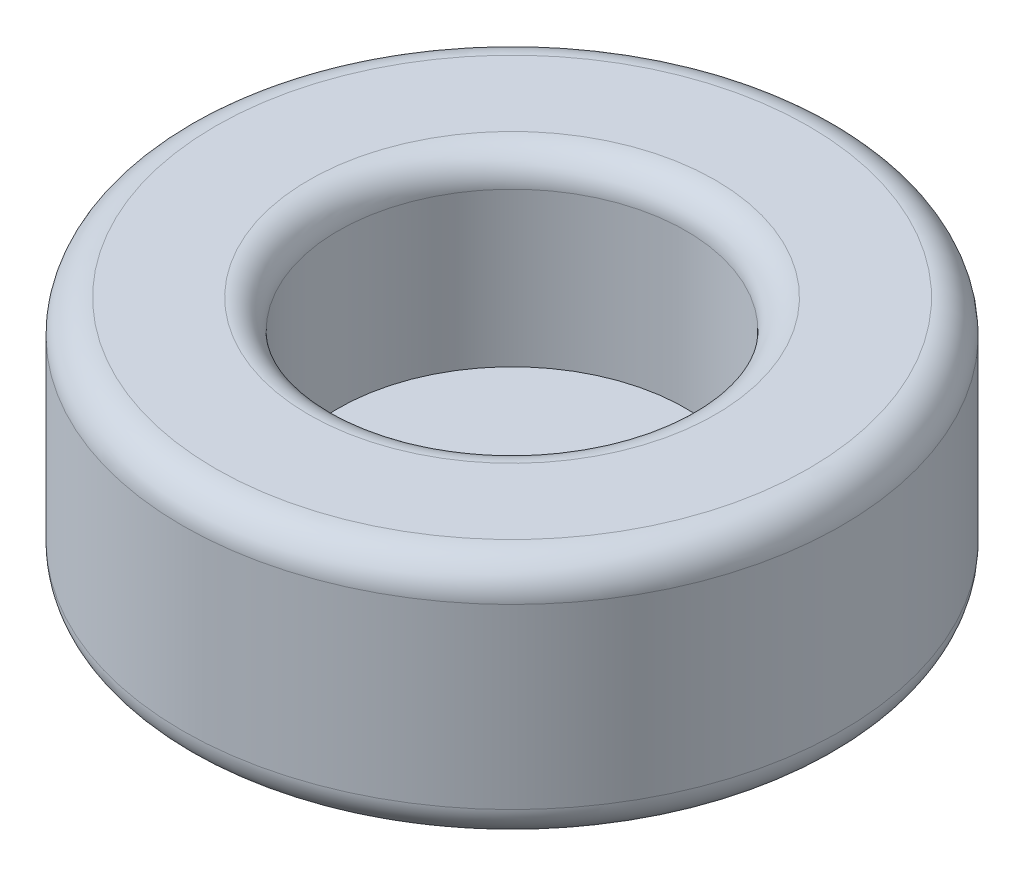
ISO-10303-21;
HEADER;
FILE_DESCRIPTION(('STEP AP214'),'2;1');
FILE_NAME('part.step','',(''),(''),'','','');
FILE_SCHEMA(('AUTOMOTIVE_DESIGN { 1 0 10303 214 1 1 1 1 }'));
ENDSEC;
DATA;
#1=APPLICATION_CONTEXT('core data for automotive mechanical design processes');
#2=APPLICATION_PROTOCOL_DEFINITION('international standard','automotive_design',2000,#1);
#3=PRODUCT_CONTEXT('',#1,'mechanical');
#4=PRODUCT('Part','Part','',(#3));
#5=PRODUCT_RELATED_PRODUCT_CATEGORY('part','',(#4));
#6=PRODUCT_DEFINITION_FORMATION('','',#4);
#7=PRODUCT_DEFINITION_CONTEXT('part definition',#1,'design');
#8=PRODUCT_DEFINITION('design','',#6,#7);
#9=PRODUCT_DEFINITION_SHAPE('','',#8);
#10=(LENGTH_UNIT() NAMED_UNIT(*) SI_UNIT(.MILLI.,.METRE.));
#11=(NAMED_UNIT(*) PLANE_ANGLE_UNIT() SI_UNIT($,.RADIAN.));
#12=(NAMED_UNIT(*) SI_UNIT($,.STERADIAN.) SOLID_ANGLE_UNIT());
#13=UNCERTAINTY_MEASURE_WITH_UNIT(LENGTH_MEASURE(1.E-05),#10,'distance_accuracy_value','');
#14=(GEOMETRIC_REPRESENTATION_CONTEXT(3) GLOBAL_UNCERTAINTY_ASSIGNED_CONTEXT((#13)) GLOBAL_UNIT_ASSIGNED_CONTEXT((#10,
#11,#12)) REPRESENTATION_CONTEXT('',''));
#15=CARTESIAN_POINT('',(0.,0.,0.));
#16=DIRECTION('',(0.,0.,1.));
#17=DIRECTION('',(1.,0.,0.));
#18=AXIS2_PLACEMENT_3D('',#15,#16,#17);
#19=CARTESIAN_POINT('',(0.,168.91,0.));
#20=DIRECTION('',(0.,-1.,0.));
#21=DIRECTION('',(0.,0.,-1.));
#22=AXIS2_PLACEMENT_3D('',#19,#20,#21);
#23=CYLINDRICAL_SURFACE('',#22,228.6);
#24=CARTESIAN_POINT('',(0.,146.05,0.));
#25=DIRECTION('',(0.,1.,0.));
#26=DIRECTION('',(0.,0.,1.));
#27=AXIS2_PLACEMENT_3D('',#24,#25,#26);
#28=CIRCLE('',#27,228.6);
#29=CARTESIAN_POINT('',(0.,146.05,228.6));
#30=VERTEX_POINT('',#29);
#31=EDGE_CURVE('E61',#30,#30,#28,.F.);
#32=ORIENTED_EDGE('',*,*,#31,.T.);
#33=EDGE_LOOP('',(#32));
#34=FACE_BOUND('',#33,.T.);
#35=CARTESIAN_POINT('',(0.,22.86,0.));
#36=DIRECTION('',(0.,1.,0.));
#37=DIRECTION('',(0.,0.,1.));
#38=AXIS2_PLACEMENT_3D('',#35,#36,#37);
#39=CIRCLE('',#38,228.6);
#40=CARTESIAN_POINT('',(0.,22.86,228.6));
#41=VERTEX_POINT('',#40);
#42=EDGE_CURVE('E67',#41,#41,#39,.T.);
#43=ORIENTED_EDGE('',*,*,#42,.T.);
#44=EDGE_LOOP('',(#43));
#45=FACE_BOUND('',#44,.T.);
#46=ADVANCED_FACE('F43',(#34,#45),#23,.T.);
#47=CARTESIAN_POINT('',(0.,168.91,0.));
#48=DIRECTION('',(0.,1.,0.));
#49=DIRECTION('',(0.,0.,1.));
#50=AXIS2_PLACEMENT_3D('',#47,#48,#49);
#51=PLANE('',#50);
#52=CARTESIAN_POINT('',(0.,168.91,0.));
#53=DIRECTION('',(0.,1.,0.));
#54=DIRECTION('',(0.,0.,1.));
#55=AXIS2_PLACEMENT_3D('',#52,#53,#54);
#56=CIRCLE('',#55,140.97);
#57=CARTESIAN_POINT('',(0.,168.91,140.97));
#58=VERTEX_POINT('',#57);
#59=EDGE_CURVE('E10',#58,#58,#56,.F.);
#60=ORIENTED_EDGE('',*,*,#59,.T.);
#61=EDGE_LOOP('',(#60));
#62=FACE_BOUND('',#61,.T.);
#63=CARTESIAN_POINT('',(0.,168.91,0.));
#64=DIRECTION('',(0.,1.,0.));
#65=DIRECTION('',(0.,0.,1.));
#66=AXIS2_PLACEMENT_3D('',#63,#64,#65);
#67=CIRCLE('',#66,205.74);
#68=CARTESIAN_POINT('',(0.,168.91,205.74));
#69=VERTEX_POINT('',#68);
#70=EDGE_CURVE('E71',#69,#69,#67,.T.);
#71=ORIENTED_EDGE('',*,*,#70,.T.);
#72=EDGE_LOOP('',(#71));
#73=FACE_BOUND('',#72,.T.);
#74=ADVANCED_FACE('F97',(#62,#73),#51,.T.);
#75=CARTESIAN_POINT('',(0.,0.,0.));
#76=DIRECTION('',(0.,1.,0.));
#77=DIRECTION('',(0.,0.,1.));
#78=AXIS2_PLACEMENT_3D('',#75,#76,#77);
#79=PLANE('',#78);
#80=CARTESIAN_POINT('',(0.,0.,0.));
#81=DIRECTION('',(0.,1.,0.));
#82=DIRECTION('',(0.,0.,1.));
#83=AXIS2_PLACEMENT_3D('',#80,#81,#82);
#84=CIRCLE('',#83,205.74);
#85=CARTESIAN_POINT('',(0.,0.,205.74));
#86=VERTEX_POINT('',#85);
#87=EDGE_CURVE('E56',#86,#86,#84,.F.);
#88=ORIENTED_EDGE('',*,*,#87,.T.);
#89=EDGE_LOOP('',(#88));
#90=FACE_BOUND('',#89,.T.);
#91=ADVANCED_FACE('F103',(#90),#79,.F.);
#92=CARTESIAN_POINT('',(0.,146.05,0.));
#93=DIRECTION('',(0.,1.,0.));
#94=DIRECTION('',(0.,0.,1.));
#95=AXIS2_PLACEMENT_3D('',#92,#93,#94);
#96=TOROIDAL_SURFACE('',#95,205.74,22.86);
#97=ORIENTED_EDGE('',*,*,#31,.F.);
#98=EDGE_LOOP('',(#97));
#99=FACE_BOUND('',#98,.T.);
#100=ORIENTED_EDGE('',*,*,#70,.F.);
#101=EDGE_LOOP('',(#100));
#102=FACE_BOUND('',#101,.T.);
#103=ADVANCED_FACE('F93',(#99,#102),#96,.T.);
#104=CARTESIAN_POINT('',(0.,22.86,0.));
#105=DIRECTION('',(0.,1.,0.));
#106=DIRECTION('',(0.,0.,1.));
#107=AXIS2_PLACEMENT_3D('',#104,#105,#106);
#108=TOROIDAL_SURFACE('',#107,205.74,22.86);
#109=ORIENTED_EDGE('',*,*,#87,.F.);
#110=EDGE_LOOP('',(#109));
#111=FACE_BOUND('',#110,.T.);
#112=ORIENTED_EDGE('',*,*,#42,.F.);
#113=EDGE_LOOP('',(#112));
#114=FACE_BOUND('',#113,.T.);
#115=ADVANCED_FACE('F84',(#111,#114),#108,.T.);
#116=CARTESIAN_POINT('',(0.,41.91,0.));
#117=DIRECTION('',(0.,1.,0.));
#118=DIRECTION('',(0.,0.,1.));
#119=AXIS2_PLACEMENT_3D('',#116,#117,#118);
#120=CYLINDRICAL_SURFACE('',#119,120.65);
#121=CARTESIAN_POINT('',(0.,148.59,0.));
#122=DIRECTION('',(0.,1.,0.));
#123=DIRECTION('',(0.,0.,1.));
#124=AXIS2_PLACEMENT_3D('',#121,#122,#123);
#125=CIRCLE('',#124,120.65);
#126=CARTESIAN_POINT('',(0.,148.59,120.65));
#127=VERTEX_POINT('',#126);
#128=EDGE_CURVE('E51',#127,#127,#125,.T.);
#129=ORIENTED_EDGE('',*,*,#128,.T.);
#130=EDGE_LOOP('',(#129));
#131=FACE_BOUND('',#130,.T.);
#132=CARTESIAN_POINT('',(0.,41.91,0.));
#133=DIRECTION('',(0.,1.,0.));
#134=DIRECTION('',(0.,0.,1.));
#135=AXIS2_PLACEMENT_3D('',#132,#133,#134);
#136=CIRCLE('',#135,120.65);
#137=CARTESIAN_POINT('',(0.,41.91,120.65));
#138=VERTEX_POINT('',#137);
#139=EDGE_CURVE('E75',#138,#138,#136,.T.);
#140=ORIENTED_EDGE('',*,*,#139,.F.);
#141=EDGE_LOOP('',(#140));
#142=FACE_BOUND('',#141,.T.);
#143=ADVANCED_FACE('F82',(#131,#142),#120,.F.);
#144=CARTESIAN_POINT('',(0.,41.91,0.));
#145=DIRECTION('',(0.,1.,0.));
#146=DIRECTION('',(0.,0.,1.));
#147=AXIS2_PLACEMENT_3D('',#144,#145,#146);
#148=PLANE('',#147);
#149=ORIENTED_EDGE('',*,*,#139,.T.);
#150=EDGE_LOOP('',(#149));
#151=FACE_BOUND('',#150,.T.);
#152=ADVANCED_FACE('F80',(#151),#148,.T.);
#153=CARTESIAN_POINT('',(0.,148.59,0.));
#154=DIRECTION('',(0.,1.,0.));
#155=DIRECTION('',(0.,0.,1.));
#156=AXIS2_PLACEMENT_3D('',#153,#154,#155);
#157=TOROIDAL_SURFACE('',#156,140.97,20.32);
#158=ORIENTED_EDGE('',*,*,#59,.F.);
#159=EDGE_LOOP('',(#158));
#160=FACE_BOUND('',#159,.T.);
#161=ORIENTED_EDGE('',*,*,#128,.F.);
#162=EDGE_LOOP('',(#161));
#163=FACE_BOUND('',#162,.T.);
#164=ADVANCED_FACE('F45',(#160,#163),#157,.T.);
#165=CLOSED_SHELL('',(#46,#74,#91,#103,#115,#143,#152,#164));
#166=MANIFOLD_SOLID_BREP('B2',#165);
#167=ADVANCED_BREP_SHAPE_REPRESENTATION('',(#18,#166),#14);
#168=SHAPE_DEFINITION_REPRESENTATION(#9,#167);
ENDSEC;
END-ISO-10303-21;
